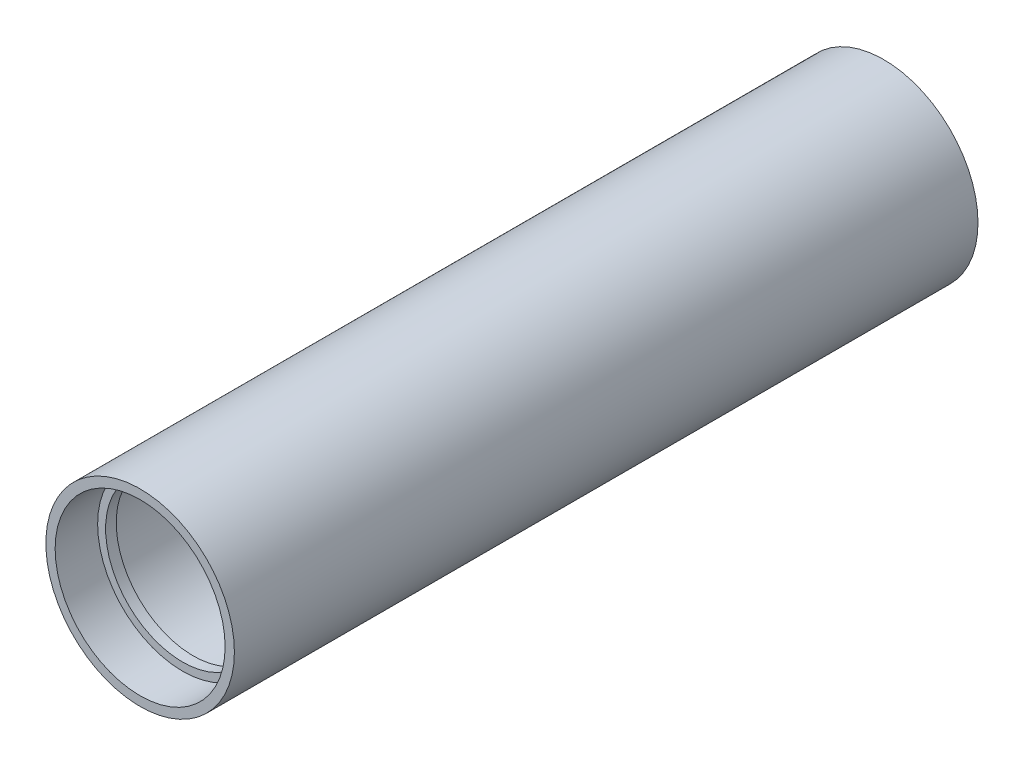
ISO-10303-21;
HEADER;
FILE_DESCRIPTION(('STEP AP214'),'2;1');
FILE_NAME('part.step','',(''),(''),'','','');
FILE_SCHEMA(('AUTOMOTIVE_DESIGN { 1 0 10303 214 1 1 1 1 }'));
ENDSEC;
DATA;
#1=APPLICATION_CONTEXT('core data for automotive mechanical design processes');
#2=APPLICATION_PROTOCOL_DEFINITION('international standard','automotive_design',2000,#1);
#3=PRODUCT_CONTEXT('',#1,'mechanical');
#4=PRODUCT('Part','Part','',(#3));
#5=PRODUCT_RELATED_PRODUCT_CATEGORY('part','',(#4));
#6=PRODUCT_DEFINITION_FORMATION('','',#4);
#7=PRODUCT_DEFINITION_CONTEXT('part definition',#1,'design');
#8=PRODUCT_DEFINITION('design','',#6,#7);
#9=PRODUCT_DEFINITION_SHAPE('','',#8);
#10=(LENGTH_UNIT() NAMED_UNIT(*) SI_UNIT(.MILLI.,.METRE.));
#11=(NAMED_UNIT(*) PLANE_ANGLE_UNIT() SI_UNIT($,.RADIAN.));
#12=(NAMED_UNIT(*) SI_UNIT($,.STERADIAN.) SOLID_ANGLE_UNIT());
#13=UNCERTAINTY_MEASURE_WITH_UNIT(LENGTH_MEASURE(1.E-05),#10,'distance_accuracy_value','');
#14=(GEOMETRIC_REPRESENTATION_CONTEXT(3) GLOBAL_UNCERTAINTY_ASSIGNED_CONTEXT((#13)) GLOBAL_UNIT_ASSIGNED_CONTEXT((#10,
#11,#12)) REPRESENTATION_CONTEXT('',''));
#15=CARTESIAN_POINT('',(0.,0.,0.));
#16=DIRECTION('',(0.,0.,1.));
#17=DIRECTION('',(1.,0.,0.));
#18=AXIS2_PLACEMENT_3D('',#15,#16,#17);
#19=CARTESIAN_POINT('',(0.,0.,70.));
#20=DIRECTION('',(0.,0.,-1.));
#21=DIRECTION('',(-1.,0.,0.));
#22=AXIS2_PLACEMENT_3D('',#19,#20,#21);
#23=CYLINDRICAL_SURFACE('',#22,16.);
#24=CARTESIAN_POINT('',(0.,0.,60.));
#25=DIRECTION('',(0.,0.,1.));
#26=DIRECTION('',(1.,0.,0.));
#27=AXIS2_PLACEMENT_3D('',#24,#25,#26);
#28=CIRCLE('',#27,16.);
#29=CARTESIAN_POINT('',(16.,0.,60.));
#30=VERTEX_POINT('',#29);
#31=EDGE_CURVE('E59',#30,#30,#28,.T.);
#32=ORIENTED_EDGE('',*,*,#31,.T.);
#33=EDGE_LOOP('',(#32));
#34=FACE_BOUND('',#33,.T.);
#35=CARTESIAN_POINT('',(0.,0.,-60.));
#36=DIRECTION('',(0.,0.,1.));
#37=DIRECTION('',(1.,0.,0.));
#38=AXIS2_PLACEMENT_3D('',#35,#36,#37);
#39=CIRCLE('',#38,16.);
#40=CARTESIAN_POINT('',(16.,0.,-60.));
#41=VERTEX_POINT('',#40);
#42=EDGE_CURVE('E68',#41,#41,#39,.T.);
#43=ORIENTED_EDGE('',*,*,#42,.F.);
#44=EDGE_LOOP('',(#43));
#45=FACE_BOUND('',#44,.T.);
#46=ADVANCED_FACE('F35',(#34,#45),#23,.F.);
#47=CARTESIAN_POINT('',(0.,0.,-62.));
#48=DIRECTION('',(0.,0.,-1.));
#49=DIRECTION('',(-1.,0.,0.));
#50=AXIS2_PLACEMENT_3D('',#47,#48,#49);
#51=CIRCLE('',#50,16.);
#52=CARTESIAN_POINT('',(-16.,0.,-62.));
#53=VERTEX_POINT('',#52);
#54=EDGE_CURVE('E10',#53,#53,#51,.T.);
#55=ORIENTED_EDGE('',*,*,#54,.F.);
#56=EDGE_LOOP('',(#55));
#57=FACE_BOUND('',#56,.T.);
#58=CARTESIAN_POINT('',(0.,0.,-70.));
#59=DIRECTION('',(0.,0.,1.));
#60=DIRECTION('',(1.,0.,0.));
#61=AXIS2_PLACEMENT_3D('',#58,#59,#60);
#62=CIRCLE('',#61,16.);
#63=CARTESIAN_POINT('',(16.,0.,-70.));
#64=VERTEX_POINT('',#63);
#65=EDGE_CURVE('E56',#64,#64,#62,.T.);
#66=ORIENTED_EDGE('',*,*,#65,.F.);
#67=EDGE_LOOP('',(#66));
#68=FACE_BOUND('',#67,.T.);
#69=ADVANCED_FACE('F95',(#57,#68),#23,.F.);
#70=CARTESIAN_POINT('',(0.,0.,70.));
#71=DIRECTION('',(0.,0.,1.));
#72=DIRECTION('',(1.,0.,0.));
#73=AXIS2_PLACEMENT_3D('',#70,#71,#72);
#74=PLANE('',#73);
#75=CARTESIAN_POINT('',(0.,0.,70.));
#76=DIRECTION('',(0.,0.,1.));
#77=DIRECTION('',(1.,0.,0.));
#78=AXIS2_PLACEMENT_3D('',#75,#76,#77);
#79=CIRCLE('',#78,17.75);
#80=CARTESIAN_POINT('',(17.75,0.,70.));
#81=VERTEX_POINT('',#80);
#82=EDGE_CURVE('E46',#81,#81,#79,.T.);
#83=ORIENTED_EDGE('',*,*,#82,.T.);
#84=EDGE_LOOP('',(#83));
#85=FACE_BOUND('',#84,.T.);
#86=CARTESIAN_POINT('',(0.,0.,70.));
#87=DIRECTION('',(0.,0.,1.));
#88=DIRECTION('',(1.,0.,0.));
#89=AXIS2_PLACEMENT_3D('',#86,#87,#88);
#90=CIRCLE('',#89,16.);
#91=CARTESIAN_POINT('',(16.,0.,70.));
#92=VERTEX_POINT('',#91);
#93=EDGE_CURVE('E54',#92,#92,#90,.T.);
#94=ORIENTED_EDGE('',*,*,#93,.F.);
#95=EDGE_LOOP('',(#94));
#96=FACE_BOUND('',#95,.T.);
#97=ADVANCED_FACE('F102',(#85,#96),#74,.T.);
#98=CARTESIAN_POINT('',(0.,0.,-70.));
#99=DIRECTION('',(0.,0.,1.));
#100=DIRECTION('',(1.,0.,0.));
#101=AXIS2_PLACEMENT_3D('',#98,#99,#100);
#102=PLANE('',#101);
#103=CARTESIAN_POINT('',(0.,0.,-70.));
#104=DIRECTION('',(0.,0.,1.));
#105=DIRECTION('',(1.,0.,0.));
#106=AXIS2_PLACEMENT_3D('',#103,#104,#105);
#107=CIRCLE('',#106,17.75);
#108=CARTESIAN_POINT('',(17.75,0.,-70.));
#109=VERTEX_POINT('',#108);
#110=EDGE_CURVE('E50',#109,#109,#107,.T.);
#111=ORIENTED_EDGE('',*,*,#110,.F.);
#112=EDGE_LOOP('',(#111));
#113=FACE_BOUND('',#112,.T.);
#114=ORIENTED_EDGE('',*,*,#65,.T.);
#115=EDGE_LOOP('',(#114));
#116=FACE_BOUND('',#115,.T.);
#117=ADVANCED_FACE('F115',(#113,#116),#102,.F.);
#118=CARTESIAN_POINT('',(0.,0.,70.));
#119=DIRECTION('',(0.,0.,-1.));
#120=DIRECTION('',(-1.,0.,0.));
#121=AXIS2_PLACEMENT_3D('',#118,#119,#120);
#122=CYLINDRICAL_SURFACE('',#121,17.75);
#123=ORIENTED_EDGE('',*,*,#82,.F.);
#124=EDGE_LOOP('',(#123));
#125=FACE_BOUND('',#124,.T.);
#126=ORIENTED_EDGE('',*,*,#110,.T.);
#127=EDGE_LOOP('',(#126));
#128=FACE_BOUND('',#127,.T.);
#129=ADVANCED_FACE('F37',(#125,#128),#122,.T.);
#130=CARTESIAN_POINT('',(0.,0.,62.));
#131=DIRECTION('',(0.,0.,1.));
#132=DIRECTION('',(1.,0.,0.));
#133=AXIS2_PLACEMENT_3D('',#130,#131,#132);
#134=CIRCLE('',#133,16.);
#135=CARTESIAN_POINT('',(16.,0.,62.));
#136=VERTEX_POINT('',#135);
#137=EDGE_CURVE('E42',#136,#136,#134,.T.);
#138=ORIENTED_EDGE('',*,*,#137,.F.);
#139=EDGE_LOOP('',(#138));
#140=FACE_BOUND('',#139,.T.);
#141=ORIENTED_EDGE('',*,*,#93,.T.);
#142=EDGE_LOOP('',(#141));
#143=FACE_BOUND('',#142,.T.);
#144=ADVANCED_FACE('F98',(#140,#143),#23,.F.);
#145=CARTESIAN_POINT('',(0.,0.,62.));
#146=DIRECTION('',(0.,0.,1.));
#147=DIRECTION('',(1.,0.,0.));
#148=AXIS2_PLACEMENT_3D('',#145,#146,#147);
#149=PLANE('',#148);
#150=ORIENTED_EDGE('',*,*,#137,.T.);
#151=EDGE_LOOP('',(#150));
#152=FACE_BOUND('',#151,.T.);
#153=CARTESIAN_POINT('',(0.,0.,62.));
#154=DIRECTION('',(0.,0.,1.));
#155=DIRECTION('',(1.,0.,0.));
#156=AXIS2_PLACEMENT_3D('',#153,#154,#155);
#157=CIRCLE('',#156,14.5);
#158=CARTESIAN_POINT('',(14.5,0.,62.));
#159=VERTEX_POINT('',#158);
#160=EDGE_CURVE('E64',#159,#159,#157,.T.);
#161=ORIENTED_EDGE('',*,*,#160,.F.);
#162=EDGE_LOOP('',(#161));
#163=FACE_BOUND('',#162,.T.);
#164=ADVANCED_FACE('F107',(#152,#163),#149,.T.);
#165=CARTESIAN_POINT('',(0.,0.,60.));
#166=DIRECTION('',(0.,0.,1.));
#167=DIRECTION('',(1.,0.,0.));
#168=AXIS2_PLACEMENT_3D('',#165,#166,#167);
#169=PLANE('',#168);
#170=ORIENTED_EDGE('',*,*,#31,.F.);
#171=EDGE_LOOP('',(#170));
#172=FACE_BOUND('',#171,.T.);
#173=CARTESIAN_POINT('',(0.,0.,60.));
#174=DIRECTION('',(0.,0.,1.));
#175=DIRECTION('',(1.,0.,0.));
#176=AXIS2_PLACEMENT_3D('',#173,#174,#175);
#177=CIRCLE('',#176,14.5);
#178=CARTESIAN_POINT('',(14.5,0.,60.));
#179=VERTEX_POINT('',#178);
#180=EDGE_CURVE('E65',#179,#179,#177,.T.);
#181=ORIENTED_EDGE('',*,*,#180,.T.);
#182=EDGE_LOOP('',(#181));
#183=FACE_BOUND('',#182,.T.);
#184=ADVANCED_FACE('F113',(#172,#183),#169,.F.);
#185=CARTESIAN_POINT('',(0.,0.,62.));
#186=DIRECTION('',(0.,0.,-1.));
#187=DIRECTION('',(-1.,0.,0.));
#188=AXIS2_PLACEMENT_3D('',#185,#186,#187);
#189=CYLINDRICAL_SURFACE('',#188,14.5);
#190=ORIENTED_EDGE('',*,*,#160,.T.);
#191=EDGE_LOOP('',(#190));
#192=FACE_BOUND('',#191,.T.);
#193=ORIENTED_EDGE('',*,*,#180,.F.);
#194=EDGE_LOOP('',(#193));
#195=FACE_BOUND('',#194,.T.);
#196=ADVANCED_FACE('F161',(#192,#195),#189,.F.);
#197=CARTESIAN_POINT('',(0.,0.,-62.));
#198=DIRECTION('',(0.,0.,-1.));
#199=DIRECTION('',(1.,0.,0.));
#200=AXIS2_PLACEMENT_3D('',#197,#198,#199);
#201=PLANE('',#200);
#202=CARTESIAN_POINT('',(0.,0.,-62.));
#203=DIRECTION('',(0.,0.,1.));
#204=DIRECTION('',(1.,0.,0.));
#205=AXIS2_PLACEMENT_3D('',#202,#203,#204);
#206=CIRCLE('',#205,14.5);
#207=CARTESIAN_POINT('',(14.5,0.,-62.));
#208=VERTEX_POINT('',#207);
#209=EDGE_CURVE('E73',#208,#208,#206,.T.);
#210=ORIENTED_EDGE('',*,*,#209,.T.);
#211=EDGE_LOOP('',(#210));
#212=FACE_BOUND('',#211,.T.);
#213=ORIENTED_EDGE('',*,*,#54,.T.);
#214=EDGE_LOOP('',(#213));
#215=FACE_BOUND('',#214,.T.);
#216=ADVANCED_FACE('F80',(#212,#215),#201,.T.);
#217=CARTESIAN_POINT('',(0.,0.,-60.));
#218=DIRECTION('',(0.,0.,-1.));
#219=DIRECTION('',(1.,0.,0.));
#220=AXIS2_PLACEMENT_3D('',#217,#218,#219);
#221=PLANE('',#220);
#222=CARTESIAN_POINT('',(0.,0.,-60.));
#223=DIRECTION('',(0.,0.,1.));
#224=DIRECTION('',(1.,0.,0.));
#225=AXIS2_PLACEMENT_3D('',#222,#223,#224);
#226=CIRCLE('',#225,14.5);
#227=CARTESIAN_POINT('',(14.5,0.,-60.));
#228=VERTEX_POINT('',#227);
#229=EDGE_CURVE('E74',#228,#228,#226,.T.);
#230=ORIENTED_EDGE('',*,*,#229,.F.);
#231=EDGE_LOOP('',(#230));
#232=FACE_BOUND('',#231,.T.);
#233=ORIENTED_EDGE('',*,*,#42,.T.);
#234=EDGE_LOOP('',(#233));
#235=FACE_BOUND('',#234,.T.);
#236=ADVANCED_FACE('F85',(#232,#235),#221,.F.);
#237=CARTESIAN_POINT('',(0.,0.,-62.));
#238=DIRECTION('',(0.,0.,1.));
#239=DIRECTION('',(1.,0.,0.));
#240=AXIS2_PLACEMENT_3D('',#237,#238,#239);
#241=CYLINDRICAL_SURFACE('',#240,14.5);
#242=ORIENTED_EDGE('',*,*,#209,.F.);
#243=EDGE_LOOP('',(#242));
#244=FACE_BOUND('',#243,.T.);
#245=ORIENTED_EDGE('',*,*,#229,.T.);
#246=EDGE_LOOP('',(#245));
#247=FACE_BOUND('',#246,.T.);
#248=ADVANCED_FACE('F82',(#244,#247),#241,.F.);
#249=CLOSED_SHELL('',(#46,#69,#97,#117,#129,#144,#164,#184,#196,#216,#236,#248));
#250=MANIFOLD_SOLID_BREP('B2',#249);
#251=ADVANCED_BREP_SHAPE_REPRESENTATION('',(#18,#250),#14);
#252=SHAPE_DEFINITION_REPRESENTATION(#9,#251);
ENDSEC;
END-ISO-10303-21;
